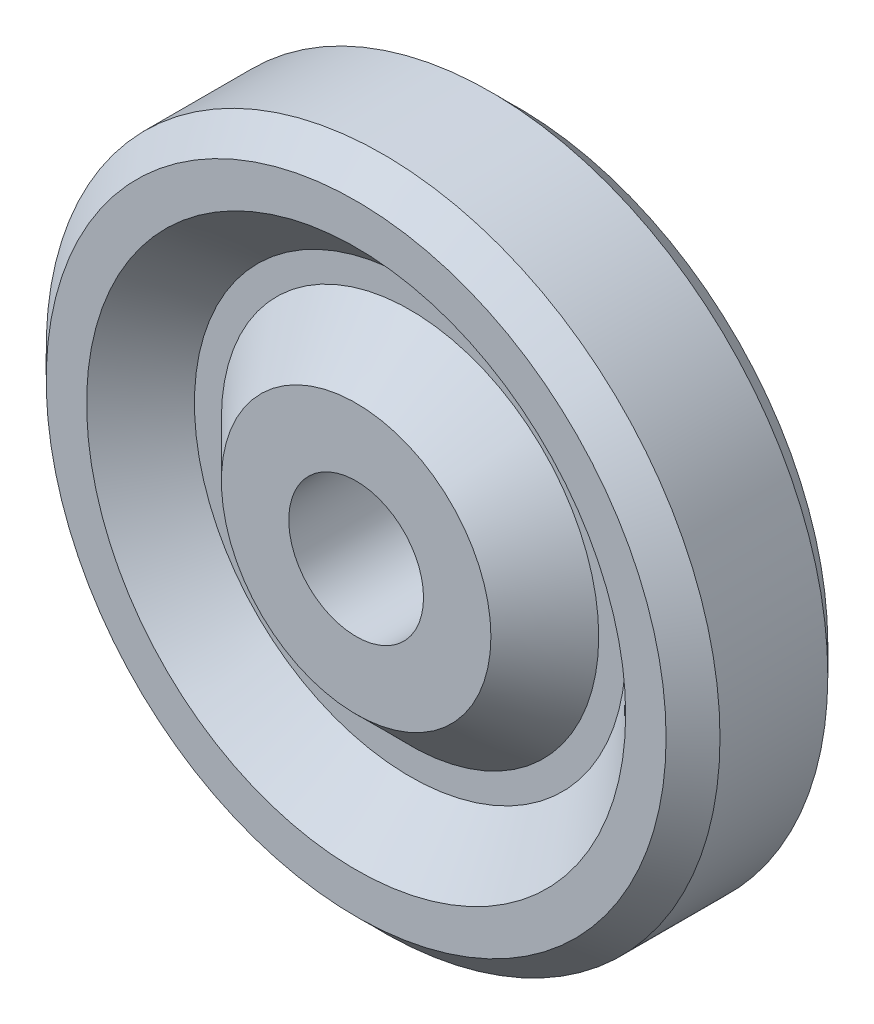
ISO-10303-21;
HEADER;
FILE_DESCRIPTION(('STEP AP214'),'2;1');
FILE_NAME('part.step','',(''),(''),'','','');
FILE_SCHEMA(('AUTOMOTIVE_DESIGN { 1 0 10303 214 1 1 1 1 }'));
ENDSEC;
DATA;
#1=APPLICATION_CONTEXT('core data for automotive mechanical design processes');
#2=APPLICATION_PROTOCOL_DEFINITION('international standard','automotive_design',2000,#1);
#3=PRODUCT_CONTEXT('',#1,'mechanical');
#4=PRODUCT('Part','Part','',(#3));
#5=PRODUCT_RELATED_PRODUCT_CATEGORY('part','',(#4));
#6=PRODUCT_DEFINITION_FORMATION('','',#4);
#7=PRODUCT_DEFINITION_CONTEXT('part definition',#1,'design');
#8=PRODUCT_DEFINITION('design','',#6,#7);
#9=PRODUCT_DEFINITION_SHAPE('','',#8);
#10=(LENGTH_UNIT() NAMED_UNIT(*) SI_UNIT(.MILLI.,.METRE.));
#11=(NAMED_UNIT(*) PLANE_ANGLE_UNIT() SI_UNIT($,.RADIAN.));
#12=(NAMED_UNIT(*) SI_UNIT($,.STERADIAN.) SOLID_ANGLE_UNIT());
#13=UNCERTAINTY_MEASURE_WITH_UNIT(LENGTH_MEASURE(1.E-05),#10,'distance_accuracy_value','');
#14=(GEOMETRIC_REPRESENTATION_CONTEXT(3) GLOBAL_UNCERTAINTY_ASSIGNED_CONTEXT((#13)) GLOBAL_UNIT_ASSIGNED_CONTEXT((#10,
#11,#12)) REPRESENTATION_CONTEXT('',''));
#15=CARTESIAN_POINT('',(0.,0.,0.));
#16=DIRECTION('',(0.,0.,1.));
#17=DIRECTION('',(1.,0.,0.));
#18=AXIS2_PLACEMENT_3D('',#15,#16,#17);
#19=CARTESIAN_POINT('',(0.,0.,-3.));
#20=DIRECTION('',(0.,0.,1.));
#21=DIRECTION('',(1.,0.,0.));
#22=AXIS2_PLACEMENT_3D('',#19,#20,#21);
#23=PLANE('',#22);
#24=CARTESIAN_POINT('',(0.,0.,-3.));
#25=DIRECTION('',(0.,0.,1.));
#26=DIRECTION('',(1.,0.,0.));
#27=AXIS2_PLACEMENT_3D('',#24,#25,#26);
#28=CIRCLE('',#27,2.5);
#29=CARTESIAN_POINT('',(2.5,0.,-3.));
#30=VERTEX_POINT('',#29);
#31=EDGE_CURVE('E57',#30,#30,#28,.T.);
#32=ORIENTED_EDGE('',*,*,#31,.T.);
#33=EDGE_LOOP('',(#32));
#34=FACE_BOUND('',#33,.T.);
#35=CARTESIAN_POINT('',(0.,0.,-3.));
#36=DIRECTION('',(0.,0.,1.));
#37=DIRECTION('',(1.,0.,0.));
#38=AXIS2_PLACEMENT_3D('',#35,#36,#37);
#39=CIRCLE('',#38,5.);
#40=CARTESIAN_POINT('',(5.,0.,-3.));
#41=VERTEX_POINT('',#40);
#42=EDGE_CURVE('E80',#41,#41,#39,.T.);
#43=ORIENTED_EDGE('',*,*,#42,.F.);
#44=EDGE_LOOP('',(#43));
#45=FACE_BOUND('',#44,.T.);
#46=ADVANCED_FACE('F37',(#34,#45),#23,.F.);
#47=CARTESIAN_POINT('',(0.,0.,3.));
#48=DIRECTION('',(0.,0.,1.));
#49=DIRECTION('',(1.,0.,0.));
#50=AXIS2_PLACEMENT_3D('',#47,#48,#49);
#51=PLANE('',#50);
#52=CARTESIAN_POINT('',(0.,0.,3.));
#53=DIRECTION('',(0.,0.,1.));
#54=DIRECTION('',(1.,0.,0.));
#55=AXIS2_PLACEMENT_3D('',#52,#53,#54);
#56=CIRCLE('',#55,2.5);
#57=CARTESIAN_POINT('',(2.5,0.,3.));
#58=VERTEX_POINT('',#57);
#59=EDGE_CURVE('E58',#58,#58,#56,.T.);
#60=ORIENTED_EDGE('',*,*,#59,.F.);
#61=EDGE_LOOP('',(#60));
#62=FACE_BOUND('',#61,.T.);
#63=CARTESIAN_POINT('',(0.,0.,3.));
#64=DIRECTION('',(0.,0.,1.));
#65=DIRECTION('',(1.,0.,0.));
#66=AXIS2_PLACEMENT_3D('',#63,#64,#65);
#67=CIRCLE('',#66,5.);
#68=CARTESIAN_POINT('',(5.,0.,3.));
#69=VERTEX_POINT('',#68);
#70=EDGE_CURVE('E70',#69,#69,#67,.T.);
#71=ORIENTED_EDGE('',*,*,#70,.T.);
#72=EDGE_LOOP('',(#71));
#73=FACE_BOUND('',#72,.T.);
#74=ADVANCED_FACE('F91',(#62,#73),#51,.T.);
#75=CARTESIAN_POINT('',(0.,0.,3.));
#76=DIRECTION('',(0.,0.,-1.));
#77=DIRECTION('',(-1.,0.,0.));
#78=AXIS2_PLACEMENT_3D('',#75,#76,#77);
#79=CYLINDRICAL_SURFACE('',#78,12.5);
#80=CARTESIAN_POINT('',(0.,0.,1.99999999999999));
#81=DIRECTION('',(0.,0.,1.));
#82=DIRECTION('',(1.,0.,0.));
#83=AXIS2_PLACEMENT_3D('',#80,#81,#82);
#84=CIRCLE('',#83,12.5);
#85=CARTESIAN_POINT('',(12.5,0.,1.99999999999999));
#86=VERTEX_POINT('',#85);
#87=EDGE_CURVE('E44',#86,#86,#84,.F.);
#88=ORIENTED_EDGE('',*,*,#87,.T.);
#89=EDGE_LOOP('',(#88));
#90=FACE_BOUND('',#89,.T.);
#91=CARTESIAN_POINT('',(0.,0.,-2.));
#92=DIRECTION('',(0.,0.,1.));
#93=DIRECTION('',(1.,0.,0.));
#94=AXIS2_PLACEMENT_3D('',#91,#92,#93);
#95=CIRCLE('',#94,12.5);
#96=CARTESIAN_POINT('',(12.5,0.,-2.));
#97=VERTEX_POINT('',#96);
#98=EDGE_CURVE('E48',#97,#97,#95,.T.);
#99=ORIENTED_EDGE('',*,*,#98,.T.);
#100=EDGE_LOOP('',(#99));
#101=FACE_BOUND('',#100,.T.);
#102=ADVANCED_FACE('F100',(#90,#101),#79,.T.);
#103=CARTESIAN_POINT('',(0.,0.,3.));
#104=DIRECTION('',(0.,0.,1.));
#105=DIRECTION('',(1.,0.,0.));
#106=AXIS2_PLACEMENT_3D('',#103,#104,#105);
#107=CIRCLE('',#106,11.5);
#108=CARTESIAN_POINT('',(11.5,0.,3.));
#109=VERTEX_POINT('',#108);
#110=EDGE_CURVE('E52',#109,#109,#107,.T.);
#111=ORIENTED_EDGE('',*,*,#110,.T.);
#112=EDGE_LOOP('',(#111));
#113=FACE_BOUND('',#112,.T.);
#114=CARTESIAN_POINT('',(0.,0.,3.));
#115=DIRECTION('',(0.,0.,1.));
#116=DIRECTION('',(1.,0.,0.));
#117=AXIS2_PLACEMENT_3D('',#114,#115,#116);
#118=CIRCLE('',#117,10.);
#119=CARTESIAN_POINT('',(10.,0.,3.));
#120=VERTEX_POINT('',#119);
#121=EDGE_CURVE('E66',#120,#120,#118,.T.);
#122=ORIENTED_EDGE('',*,*,#121,.F.);
#123=EDGE_LOOP('',(#122));
#124=FACE_BOUND('',#123,.T.);
#125=ADVANCED_FACE('F103',(#113,#124),#51,.T.);
#126=CARTESIAN_POINT('',(0.,0.,-3.));
#127=DIRECTION('',(0.,0.,1.));
#128=DIRECTION('',(1.,0.,0.));
#129=AXIS2_PLACEMENT_3D('',#126,#127,#128);
#130=CIRCLE('',#129,11.5);
#131=CARTESIAN_POINT('',(11.5,0.,-3.));
#132=VERTEX_POINT('',#131);
#133=EDGE_CURVE('E10',#132,#132,#130,.F.);
#134=ORIENTED_EDGE('',*,*,#133,.T.);
#135=EDGE_LOOP('',(#134));
#136=FACE_BOUND('',#135,.T.);
#137=CARTESIAN_POINT('',(0.,0.,-3.));
#138=DIRECTION('',(0.,0.,1.));
#139=DIRECTION('',(1.,0.,0.));
#140=AXIS2_PLACEMENT_3D('',#137,#138,#139);
#141=CIRCLE('',#140,10.);
#142=CARTESIAN_POINT('',(10.,0.,-3.));
#143=VERTEX_POINT('',#142);
#144=EDGE_CURVE('E79',#143,#143,#141,.T.);
#145=ORIENTED_EDGE('',*,*,#144,.T.);
#146=EDGE_LOOP('',(#145));
#147=FACE_BOUND('',#146,.T.);
#148=ADVANCED_FACE('F94',(#136,#147),#23,.F.);
#149=CARTESIAN_POINT('',(0.,0.,-3.));
#150=DIRECTION('',(0.,0.,1.));
#151=DIRECTION('',(1.,0.,0.));
#152=AXIS2_PLACEMENT_3D('',#149,#150,#151);
#153=CYLINDRICAL_SURFACE('',#152,2.5);
#154=ORIENTED_EDGE('',*,*,#31,.F.);
#155=EDGE_LOOP('',(#154));
#156=FACE_BOUND('',#155,.T.);
#157=ORIENTED_EDGE('',*,*,#59,.T.);
#158=EDGE_LOOP('',(#157));
#159=FACE_BOUND('',#158,.T.);
#160=ADVANCED_FACE('F106',(#156,#159),#153,.F.);
#161=CARTESIAN_POINT('',(0.,0.,3.));
#162=DIRECTION('',(0.,0.,1.));
#163=DIRECTION('',(1.,0.,0.));
#164=AXIS2_PLACEMENT_3D('',#161,#162,#163);
#165=CONICAL_SURFACE('',#164,10.,0.78539816339745);
#166=CARTESIAN_POINT('',(0.,0.,1.));
#167=DIRECTION('',(0.,0.,1.));
#168=DIRECTION('',(1.,0.,0.));
#169=AXIS2_PLACEMENT_3D('',#166,#167,#168);
#170=CIRCLE('',#169,7.99999999999999);
#171=CARTESIAN_POINT('',(7.99999999999999,0.,1.));
#172=VERTEX_POINT('',#171);
#173=EDGE_CURVE('E61',#172,#172,#170,.T.);
#174=ORIENTED_EDGE('',*,*,#173,.F.);
#175=EDGE_LOOP('',(#174));
#176=FACE_BOUND('',#175,.T.);
#177=ORIENTED_EDGE('',*,*,#121,.T.);
#178=EDGE_LOOP('',(#177));
#179=FACE_BOUND('',#178,.T.);
#180=ADVANCED_FACE('F112',(#176,#179),#165,.F.);
#181=CARTESIAN_POINT('',(0.,0.,1.));
#182=DIRECTION('',(0.,0.,1.));
#183=DIRECTION('',(1.,0.,0.));
#184=AXIS2_PLACEMENT_3D('',#181,#182,#183);
#185=PLANE('',#184);
#186=CARTESIAN_POINT('',(0.,0.,1.));
#187=DIRECTION('',(0.,0.,1.));
#188=DIRECTION('',(1.,0.,0.));
#189=AXIS2_PLACEMENT_3D('',#186,#187,#188);
#190=CIRCLE('',#189,7.00000000000001);
#191=CARTESIAN_POINT('',(7.00000000000001,0.,1.));
#192=VERTEX_POINT('',#191);
#193=EDGE_CURVE('E67',#192,#192,#190,.T.);
#194=ORIENTED_EDGE('',*,*,#193,.F.);
#195=EDGE_LOOP('',(#194));
#196=FACE_BOUND('',#195,.T.);
#197=ORIENTED_EDGE('',*,*,#173,.T.);
#198=EDGE_LOOP('',(#197));
#199=FACE_BOUND('',#198,.T.);
#200=ADVANCED_FACE('F134',(#196,#199),#185,.T.);
#201=CARTESIAN_POINT('',(0.,0.,3.));
#202=DIRECTION('',(0.,0.,-1.));
#203=DIRECTION('',(1.,0.,0.));
#204=AXIS2_PLACEMENT_3D('',#201,#202,#203);
#205=CONICAL_SURFACE('',#204,5.,0.78539816339745);
#206=ORIENTED_EDGE('',*,*,#193,.T.);
#207=EDGE_LOOP('',(#206));
#208=FACE_BOUND('',#207,.T.);
#209=ORIENTED_EDGE('',*,*,#70,.F.);
#210=EDGE_LOOP('',(#209));
#211=FACE_BOUND('',#210,.T.);
#212=ADVANCED_FACE('F130',(#208,#211),#205,.T.);
#213=CARTESIAN_POINT('',(0.,0.,-1.));
#214=DIRECTION('',(0.,0.,-1.));
#215=DIRECTION('',(1.,0.,0.));
#216=AXIS2_PLACEMENT_3D('',#213,#214,#215);
#217=PLANE('',#216);
#218=CARTESIAN_POINT('',(0.,0.,-1.));
#219=DIRECTION('',(0.,0.,-1.));
#220=DIRECTION('',(-1.,0.,0.));
#221=AXIS2_PLACEMENT_3D('',#218,#219,#220);
#222=CIRCLE('',#221,7.99999999999999);
#223=CARTESIAN_POINT('',(-7.99999999999999,0.,-1.));
#224=VERTEX_POINT('',#223);
#225=EDGE_CURVE('E75',#224,#224,#222,.F.);
#226=ORIENTED_EDGE('',*,*,#225,.F.);
#227=EDGE_LOOP('',(#226));
#228=FACE_BOUND('',#227,.T.);
#229=CARTESIAN_POINT('',(0.,0.,-1.));
#230=DIRECTION('',(0.,0.,-1.));
#231=DIRECTION('',(-1.,0.,0.));
#232=AXIS2_PLACEMENT_3D('',#229,#230,#231);
#233=CIRCLE('',#232,7.00000000000001);
#234=CARTESIAN_POINT('',(-7.00000000000001,0.,-1.));
#235=VERTEX_POINT('',#234);
#236=EDGE_CURVE('E76',#235,#235,#233,.F.);
#237=ORIENTED_EDGE('',*,*,#236,.T.);
#238=EDGE_LOOP('',(#237));
#239=FACE_BOUND('',#238,.T.);
#240=ADVANCED_FACE('F121',(#228,#239),#217,.T.);
#241=CARTESIAN_POINT('',(0.,0.,-3.));
#242=DIRECTION('',(0.,0.,-1.));
#243=DIRECTION('',(1.,0.,0.));
#244=AXIS2_PLACEMENT_3D('',#241,#242,#243);
#245=CONICAL_SURFACE('',#244,10.,0.78539816339745);
#246=ORIENTED_EDGE('',*,*,#225,.T.);
#247=EDGE_LOOP('',(#246));
#248=FACE_BOUND('',#247,.T.);
#249=ORIENTED_EDGE('',*,*,#144,.F.);
#250=EDGE_LOOP('',(#249));
#251=FACE_BOUND('',#250,.T.);
#252=ADVANCED_FACE('F119',(#248,#251),#245,.F.);
#253=CARTESIAN_POINT('',(0.,0.,-3.));
#254=DIRECTION('',(0.,0.,1.));
#255=DIRECTION('',(1.,0.,0.));
#256=AXIS2_PLACEMENT_3D('',#253,#254,#255);
#257=CONICAL_SURFACE('',#256,5.,0.78539816339745);
#258=ORIENTED_EDGE('',*,*,#236,.F.);
#259=EDGE_LOOP('',(#258));
#260=FACE_BOUND('',#259,.T.);
#261=ORIENTED_EDGE('',*,*,#42,.T.);
#262=EDGE_LOOP('',(#261));
#263=FACE_BOUND('',#262,.T.);
#264=ADVANCED_FACE('F88',(#260,#263),#257,.T.);
#265=CARTESIAN_POINT('',(0.,0.,3.));
#266=DIRECTION('',(0.,0.,-1.));
#267=DIRECTION('',(-1.,0.,0.));
#268=AXIS2_PLACEMENT_3D('',#265,#266,#267);
#269=CONICAL_SURFACE('',#268,11.5,0.785398163397442);
#270=ORIENTED_EDGE('',*,*,#87,.F.);
#271=EDGE_LOOP('',(#270));
#272=FACE_BOUND('',#271,.T.);
#273=ORIENTED_EDGE('',*,*,#110,.F.);
#274=EDGE_LOOP('',(#273));
#275=FACE_BOUND('',#274,.T.);
#276=ADVANCED_FACE('F127',(#272,#275),#269,.T.);
#277=CARTESIAN_POINT('',(0.,0.,-2.));
#278=DIRECTION('',(0.,0.,1.));
#279=DIRECTION('',(1.,0.,0.));
#280=AXIS2_PLACEMENT_3D('',#277,#278,#279);
#281=CONICAL_SURFACE('',#280,12.5,0.785398163397451);
#282=ORIENTED_EDGE('',*,*,#133,.F.);
#283=EDGE_LOOP('',(#282));
#284=FACE_BOUND('',#283,.T.);
#285=ORIENTED_EDGE('',*,*,#98,.F.);
#286=EDGE_LOOP('',(#285));
#287=FACE_BOUND('',#286,.T.);
#288=ADVANCED_FACE('F39',(#284,#287),#281,.T.);
#289=CLOSED_SHELL('',(#46,#74,#102,#125,#148,#160,#180,#200,#212,#240,#252,#264,#276,#288));
#290=MANIFOLD_SOLID_BREP('B2',#289);
#291=ADVANCED_BREP_SHAPE_REPRESENTATION('',(#18,#290),#14);
#292=SHAPE_DEFINITION_REPRESENTATION(#9,#291);
ENDSEC;
END-ISO-10303-21;
